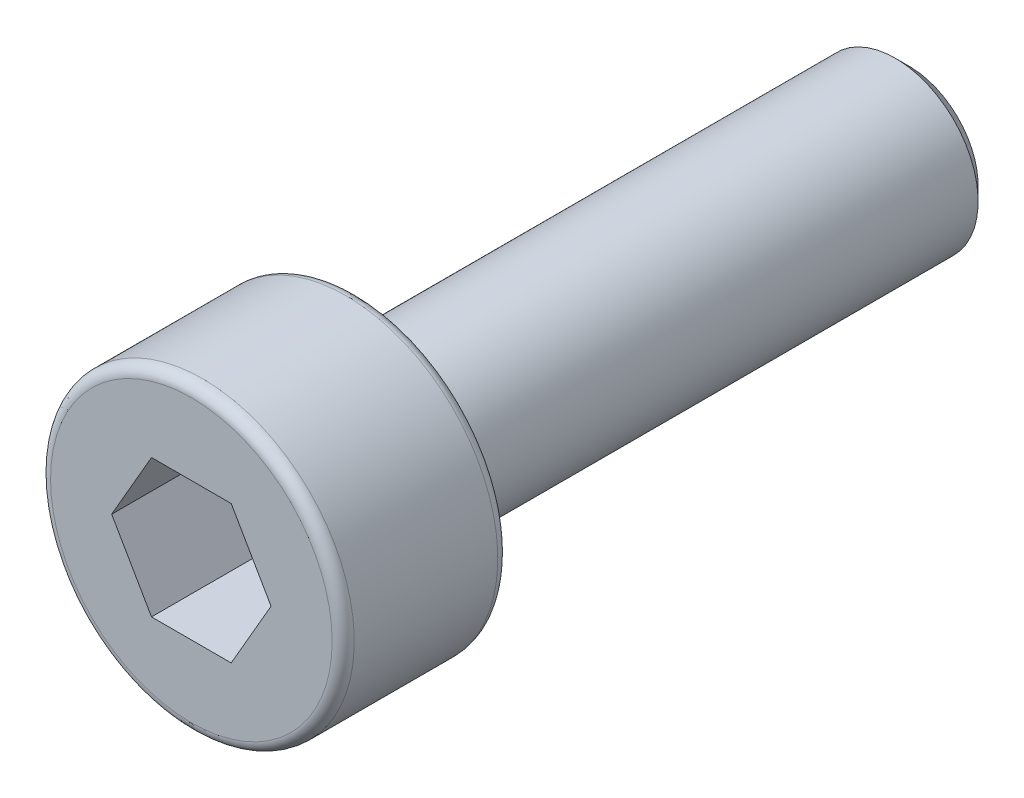
ISO-10303-21;
HEADER;
FILE_DESCRIPTION(('STEP AP214'),'2;1');
FILE_NAME('part.step','',(''),(''),'','','');
FILE_SCHEMA(('AUTOMOTIVE_DESIGN { 1 0 10303 214 1 1 1 1 }'));
ENDSEC;
DATA;
#1=APPLICATION_CONTEXT('core data for automotive mechanical design processes');
#2=APPLICATION_PROTOCOL_DEFINITION('international standard','automotive_design',2000,#1);
#3=PRODUCT_CONTEXT('',#1,'mechanical');
#4=PRODUCT('Part','Part','',(#3));
#5=PRODUCT_RELATED_PRODUCT_CATEGORY('part','',(#4));
#6=PRODUCT_DEFINITION_FORMATION('','',#4);
#7=PRODUCT_DEFINITION_CONTEXT('part definition',#1,'design');
#8=PRODUCT_DEFINITION('design','',#6,#7);
#9=PRODUCT_DEFINITION_SHAPE('','',#8);
#10=(LENGTH_UNIT() NAMED_UNIT(*) SI_UNIT(.MILLI.,.METRE.));
#11=(NAMED_UNIT(*) PLANE_ANGLE_UNIT() SI_UNIT($,.RADIAN.));
#12=(NAMED_UNIT(*) SI_UNIT($,.STERADIAN.) SOLID_ANGLE_UNIT());
#13=UNCERTAINTY_MEASURE_WITH_UNIT(LENGTH_MEASURE(1.E-05),#10,'distance_accuracy_value','');
#14=(GEOMETRIC_REPRESENTATION_CONTEXT(3) GLOBAL_UNCERTAINTY_ASSIGNED_CONTEXT((#13)) GLOBAL_UNIT_ASSIGNED_CONTEXT((#10,
#11,#12)) REPRESENTATION_CONTEXT('',''));
#15=CARTESIAN_POINT('',(0.,0.,0.));
#16=DIRECTION('',(0.,0.,1.));
#17=DIRECTION('',(1.,0.,0.));
#18=AXIS2_PLACEMENT_3D('',#15,#16,#17);
#19=CARTESIAN_POINT('',(0.,0.,10.));
#20=DIRECTION('',(0.,0.,-1.));
#21=DIRECTION('',(-1.,0.,0.));
#22=AXIS2_PLACEMENT_3D('',#19,#20,#21);
#23=PLANE('',#22);
#24=CARTESIAN_POINT('',(0.,0.,10.));
#25=DIRECTION('',(0.,0.,-1.));
#26=DIRECTION('',(-1.,0.,0.));
#27=AXIS2_PLACEMENT_3D('',#24,#25,#26);
#28=CIRCLE('',#27,2.55);
#29=CARTESIAN_POINT('',(-2.55,0.,10.));
#30=VERTEX_POINT('',#29);
#31=EDGE_CURVE('E40',#30,#30,#28,.T.);
#32=ORIENTED_EDGE('',*,*,#31,.T.);
#33=EDGE_LOOP('',(#32));
#34=FACE_BOUND('',#33,.T.);
#35=CARTESIAN_POINT('',(0.,0.,10.));
#36=DIRECTION('',(0.,0.,-1.));
#37=DIRECTION('',(-1.,0.,0.));
#38=AXIS2_PLACEMENT_3D('',#35,#36,#37);
#39=CIRCLE('',#38,1.5);
#40=CARTESIAN_POINT('',(-1.5,0.,10.));
#41=VERTEX_POINT('',#40);
#42=EDGE_CURVE('E134',#41,#41,#39,.T.);
#43=ORIENTED_EDGE('',*,*,#42,.F.);
#44=EDGE_LOOP('',(#43));
#45=FACE_BOUND('',#44,.T.);
#46=ADVANCED_FACE('F32',(#34,#45),#23,.T.);
#47=CARTESIAN_POINT('',(0.,0.,10.));
#48=DIRECTION('',(0.,0.,1.));
#49=DIRECTION('',(1.,0.,0.));
#50=AXIS2_PLACEMENT_3D('',#47,#48,#49);
#51=CYLINDRICAL_SURFACE('',#50,2.75);
#52=CARTESIAN_POINT('',(0.,0.,10.2));
#53=DIRECTION('',(0.,0.,-1.));
#54=DIRECTION('',(-1.,0.,0.));
#55=AXIS2_PLACEMENT_3D('',#52,#53,#54);
#56=CIRCLE('',#55,2.75);
#57=CARTESIAN_POINT('',(-2.75,0.,10.2));
#58=VERTEX_POINT('',#57);
#59=EDGE_CURVE('E151',#58,#58,#56,.F.);
#60=ORIENTED_EDGE('',*,*,#59,.T.);
#61=EDGE_LOOP('',(#60));
#62=FACE_BOUND('',#61,.T.);
#63=CARTESIAN_POINT('',(0.,0.,12.8));
#64=DIRECTION('',(0.,0.,-1.));
#65=DIRECTION('',(-1.,0.,0.));
#66=AXIS2_PLACEMENT_3D('',#63,#64,#65);
#67=CIRCLE('',#66,2.75);
#68=CARTESIAN_POINT('',(-2.75,0.,12.8));
#69=VERTEX_POINT('',#68);
#70=EDGE_CURVE('E148',#69,#69,#67,.T.);
#71=ORIENTED_EDGE('',*,*,#70,.T.);
#72=EDGE_LOOP('',(#71));
#73=FACE_BOUND('',#72,.T.);
#74=ADVANCED_FACE('F164',(#62,#73),#51,.T.);
#75=CARTESIAN_POINT('',(0.,0.,13.));
#76=DIRECTION('',(0.,0.,-1.));
#77=DIRECTION('',(-1.,0.,0.));
#78=AXIS2_PLACEMENT_3D('',#75,#76,#77);
#79=PLANE('',#78);
#80=CARTESIAN_POINT('',(0.,0.,13.));
#81=DIRECTION('',(0.,0.,-1.));
#82=DIRECTION('',(-1.,0.,0.));
#83=AXIS2_PLACEMENT_3D('',#80,#81,#82);
#84=CIRCLE('',#83,2.55);
#85=CARTESIAN_POINT('',(-2.55,0.,13.));
#86=VERTEX_POINT('',#85);
#87=EDGE_CURVE('E11',#86,#86,#84,.F.);
#88=ORIENTED_EDGE('',*,*,#87,.T.);
#89=EDGE_LOOP('',(#88));
#90=FACE_BOUND('',#89,.T.);
#91=DIRECTION('',(0.499999999999997,-0.866025403784441,0.));
#92=VECTOR('',#91,1.);
#93=CARTESIAN_POINT('',(-1.44337567297406,0.,13.));
#94=LINE('',#93,#92);
#95=CARTESIAN_POINT('',(-1.44337567297406,0.,13.));
#96=VERTEX_POINT('',#95);
#97=CARTESIAN_POINT('',(-0.721687836487035,-1.25,13.));
#98=VERTEX_POINT('',#97);
#99=EDGE_CURVE('E121',#96,#98,#94,.T.);
#100=ORIENTED_EDGE('',*,*,#99,.F.);
#101=DIRECTION('',(-0.499999999999998,-0.86602540378444,0.));
#102=VECTOR('',#101,1.);
#103=CARTESIAN_POINT('',(-0.721687836487033,1.25,13.));
#104=LINE('',#103,#102);
#105=CARTESIAN_POINT('',(-0.721687836487033,1.25,13.));
#106=VERTEX_POINT('',#105);
#107=EDGE_CURVE('E47',#106,#96,#104,.T.);
#108=ORIENTED_EDGE('',*,*,#107,.F.);
#109=DIRECTION('',(-1.,0.,0.));
#110=VECTOR('',#109,1.);
#111=CARTESIAN_POINT('',(0.721687836487034,1.25,13.));
#112=LINE('',#111,#110);
#113=CARTESIAN_POINT('',(0.721687836487034,1.25,13.));
#114=VERTEX_POINT('',#113);
#115=EDGE_CURVE('E130',#114,#106,#112,.T.);
#116=ORIENTED_EDGE('',*,*,#115,.F.);
#117=DIRECTION('',(-0.499999999999997,0.86602540378444,0.));
#118=VECTOR('',#117,1.);
#119=CARTESIAN_POINT('',(1.44337567297406,0.,13.));
#120=LINE('',#119,#118);
#121=CARTESIAN_POINT('',(1.44337567297406,0.,13.));
#122=VERTEX_POINT('',#121);
#123=EDGE_CURVE('E128',#122,#114,#120,.T.);
#124=ORIENTED_EDGE('',*,*,#123,.F.);
#125=DIRECTION('',(0.499999999999998,0.86602540378444,0.));
#126=VECTOR('',#125,1.);
#127=CARTESIAN_POINT('',(0.721687836487033,-1.25,13.));
#128=LINE('',#127,#126);
#129=CARTESIAN_POINT('',(0.721687836487033,-1.25,13.));
#130=VERTEX_POINT('',#129);
#131=EDGE_CURVE('E95',#130,#122,#128,.T.);
#132=ORIENTED_EDGE('',*,*,#131,.F.);
#133=DIRECTION('',(1.,0.,0.));
#134=VECTOR('',#133,1.);
#135=CARTESIAN_POINT('',(-0.721687836487035,-1.25,13.));
#136=LINE('',#135,#134);
#137=EDGE_CURVE('E124',#98,#130,#136,.T.);
#138=ORIENTED_EDGE('',*,*,#137,.F.);
#139=EDGE_LOOP('',(#100,#108,#116,#124,#132,#138));
#140=FACE_BOUND('',#139,.T.);
#141=ADVANCED_FACE('F167',(#90,#140),#79,.F.);
#142=CARTESIAN_POINT('',(0.,0.,0.));
#143=DIRECTION('',(0.,0.,1.));
#144=DIRECTION('',(1.,0.,0.));
#145=AXIS2_PLACEMENT_3D('',#142,#143,#144);
#146=CYLINDRICAL_SURFACE('',#145,1.5);
#147=CARTESIAN_POINT('',(0.,0.,0.249999999957933));
#148=DIRECTION('',(0.,0.,-1.));
#149=DIRECTION('',(-1.,0.,0.));
#150=AXIS2_PLACEMENT_3D('',#147,#148,#149);
#151=CIRCLE('',#150,1.5);
#152=CARTESIAN_POINT('',(-1.5,0.,0.249999999957933));
#153=VERTEX_POINT('',#152);
#154=EDGE_CURVE('E145',#153,#153,#151,.F.);
#155=ORIENTED_EDGE('',*,*,#154,.T.);
#156=EDGE_LOOP('',(#155));
#157=FACE_BOUND('',#156,.T.);
#158=ORIENTED_EDGE('',*,*,#42,.T.);
#159=EDGE_LOOP('',(#158));
#160=FACE_BOUND('',#159,.T.);
#161=ADVANCED_FACE('F177',(#157,#160),#146,.T.);
#162=CARTESIAN_POINT('',(0.,0.,0.));
#163=DIRECTION('',(0.,0.,-1.));
#164=DIRECTION('',(-1.,0.,0.));
#165=AXIS2_PLACEMENT_3D('',#162,#163,#164);
#166=PLANE('',#165);
#167=CARTESIAN_POINT('',(0.,0.,0.));
#168=DIRECTION('',(0.,0.,-1.));
#169=DIRECTION('',(-1.,0.,0.));
#170=AXIS2_PLACEMENT_3D('',#167,#168,#169);
#171=CIRCLE('',#170,1.25000000004207);
#172=CARTESIAN_POINT('',(-1.25000000004207,0.,0.));
#173=VERTEX_POINT('',#172);
#174=EDGE_CURVE('E142',#173,#173,#171,.T.);
#175=ORIENTED_EDGE('',*,*,#174,.T.);
#176=EDGE_LOOP('',(#175));
#177=FACE_BOUND('',#176,.T.);
#178=ADVANCED_FACE('F188',(#177),#166,.T.);
#179=CARTESIAN_POINT('',(-0.721687836487033,1.25,11.));
#180=DIRECTION('',(-0.86602540378444,0.499999999999999,0.));
#181=DIRECTION('',(-0.499999999999999,-0.86602540378444,0.));
#182=AXIS2_PLACEMENT_3D('',#179,#180,#181);
#183=PLANE('',#182);
#184=ORIENTED_EDGE('',*,*,#107,.T.);
#185=DIRECTION('',(0.,0.,1.));
#186=VECTOR('',#185,1.);
#187=CARTESIAN_POINT('',(-1.44337567297406,0.,11.));
#188=LINE('',#187,#186);
#189=CARTESIAN_POINT('',(-1.44337567297406,0.,11.));
#190=VERTEX_POINT('',#189);
#191=EDGE_CURVE('E77',#190,#96,#188,.T.);
#192=ORIENTED_EDGE('',*,*,#191,.F.);
#193=DIRECTION('',(-0.499999999999998,-0.86602540378444,0.));
#194=VECTOR('',#193,1.);
#195=CARTESIAN_POINT('',(-0.721687836487033,1.25,11.));
#196=LINE('',#195,#194);
#197=CARTESIAN_POINT('',(-0.721687836487033,1.25,11.));
#198=VERTEX_POINT('',#197);
#199=EDGE_CURVE('E132',#198,#190,#196,.T.);
#200=ORIENTED_EDGE('',*,*,#199,.F.);
#201=DIRECTION('',(0.,0.,1.));
#202=VECTOR('',#201,1.);
#203=CARTESIAN_POINT('',(-0.721687836487033,1.25,11.));
#204=LINE('',#203,#202);
#205=EDGE_CURVE('E55',#198,#106,#204,.T.);
#206=ORIENTED_EDGE('',*,*,#205,.T.);
#207=EDGE_LOOP('',(#184,#192,#200,#206));
#208=FACE_BOUND('',#207,.T.);
#209=ADVANCED_FACE('F185',(#208),#183,.F.);
#210=CARTESIAN_POINT('',(0.721687836487034,1.25,11.));
#211=DIRECTION('',(0.,1.,0.));
#212=DIRECTION('',(0.,0.,1.));
#213=AXIS2_PLACEMENT_3D('',#210,#211,#212);
#214=PLANE('',#213);
#215=ORIENTED_EDGE('',*,*,#115,.T.);
#216=ORIENTED_EDGE('',*,*,#205,.F.);
#217=DIRECTION('',(-1.,0.,0.));
#218=VECTOR('',#217,1.);
#219=CARTESIAN_POINT('',(0.721687836487034,1.25,11.));
#220=LINE('',#219,#218);
#221=CARTESIAN_POINT('',(0.721687836487034,1.25,11.));
#222=VERTEX_POINT('',#221);
#223=EDGE_CURVE('E107',#222,#198,#220,.T.);
#224=ORIENTED_EDGE('',*,*,#223,.F.);
#225=DIRECTION('',(0.,0.,1.));
#226=VECTOR('',#225,1.);
#227=CARTESIAN_POINT('',(0.721687836487034,1.25,11.));
#228=LINE('',#227,#226);
#229=EDGE_CURVE('E99',#222,#114,#228,.T.);
#230=ORIENTED_EDGE('',*,*,#229,.T.);
#231=EDGE_LOOP('',(#215,#216,#224,#230));
#232=FACE_BOUND('',#231,.T.);
#233=ADVANCED_FACE('F187',(#232),#214,.F.);
#234=CARTESIAN_POINT('',(1.44337567297406,0.,11.));
#235=DIRECTION('',(0.86602540378444,0.499999999999997,0.));
#236=DIRECTION('',(-0.499999999999997,0.86602540378444,0.));
#237=AXIS2_PLACEMENT_3D('',#234,#235,#236);
#238=PLANE('',#237);
#239=ORIENTED_EDGE('',*,*,#123,.T.);
#240=ORIENTED_EDGE('',*,*,#229,.F.);
#241=DIRECTION('',(-0.499999999999997,0.86602540378444,0.));
#242=VECTOR('',#241,1.);
#243=CARTESIAN_POINT('',(1.44337567297406,0.,11.));
#244=LINE('',#243,#242);
#245=CARTESIAN_POINT('',(1.44337567297406,0.,11.));
#246=VERTEX_POINT('',#245);
#247=EDGE_CURVE('E103',#246,#222,#244,.T.);
#248=ORIENTED_EDGE('',*,*,#247,.F.);
#249=DIRECTION('',(0.,0.,1.));
#250=VECTOR('',#249,1.);
#251=CARTESIAN_POINT('',(1.44337567297406,0.,11.));
#252=LINE('',#251,#250);
#253=EDGE_CURVE('E88',#246,#122,#252,.T.);
#254=ORIENTED_EDGE('',*,*,#253,.T.);
#255=EDGE_LOOP('',(#239,#240,#248,#254));
#256=FACE_BOUND('',#255,.T.);
#257=ADVANCED_FACE('F104',(#256),#238,.F.);
#258=CARTESIAN_POINT('',(0.721687836487033,-1.25,11.));
#259=DIRECTION('',(0.86602540378444,-0.499999999999998,0.));
#260=DIRECTION('',(0.499999999999998,0.86602540378444,0.));
#261=AXIS2_PLACEMENT_3D('',#258,#259,#260);
#262=PLANE('',#261);
#263=ORIENTED_EDGE('',*,*,#131,.T.);
#264=ORIENTED_EDGE('',*,*,#253,.F.);
#265=DIRECTION('',(0.499999999999998,0.86602540378444,0.));
#266=VECTOR('',#265,1.);
#267=CARTESIAN_POINT('',(0.721687836487033,-1.25,11.));
#268=LINE('',#267,#266);
#269=CARTESIAN_POINT('',(0.721687836487033,-1.25,11.));
#270=VERTEX_POINT('',#269);
#271=EDGE_CURVE('E92',#270,#246,#268,.T.);
#272=ORIENTED_EDGE('',*,*,#271,.F.);
#273=DIRECTION('',(0.,0.,1.));
#274=VECTOR('',#273,1.);
#275=CARTESIAN_POINT('',(0.721687836487033,-1.25,11.));
#276=LINE('',#275,#274);
#277=EDGE_CURVE('E100',#270,#130,#276,.T.);
#278=ORIENTED_EDGE('',*,*,#277,.T.);
#279=EDGE_LOOP('',(#263,#264,#272,#278));
#280=FACE_BOUND('',#279,.T.);
#281=ADVANCED_FACE('F90',(#280),#262,.F.);
#282=CARTESIAN_POINT('',(-0.721687836487035,-1.25,11.));
#283=DIRECTION('',(0.,-1.,0.));
#284=DIRECTION('',(0.,0.,-1.));
#285=AXIS2_PLACEMENT_3D('',#282,#283,#284);
#286=PLANE('',#285);
#287=ORIENTED_EDGE('',*,*,#137,.T.);
#288=ORIENTED_EDGE('',*,*,#277,.F.);
#289=DIRECTION('',(1.,0.,0.));
#290=VECTOR('',#289,1.);
#291=CARTESIAN_POINT('',(-0.721687836487035,-1.25,11.));
#292=LINE('',#291,#290);
#293=CARTESIAN_POINT('',(-0.721687836487035,-1.25,11.));
#294=VERTEX_POINT('',#293);
#295=EDGE_CURVE('E113',#294,#270,#292,.T.);
#296=ORIENTED_EDGE('',*,*,#295,.F.);
#297=DIRECTION('',(0.,0.,1.));
#298=VECTOR('',#297,1.);
#299=CARTESIAN_POINT('',(-0.721687836487035,-1.25,11.));
#300=LINE('',#299,#298);
#301=EDGE_CURVE('E137',#294,#98,#300,.T.);
#302=ORIENTED_EDGE('',*,*,#301,.T.);
#303=EDGE_LOOP('',(#287,#288,#296,#302));
#304=FACE_BOUND('',#303,.T.);
#305=ADVANCED_FACE('F273',(#304),#286,.F.);
#306=CARTESIAN_POINT('',(-1.44337567297406,0.,11.));
#307=DIRECTION('',(-0.866025403784441,-0.499999999999997,0.));
#308=DIRECTION('',(0.499999999999997,-0.866025403784441,0.));
#309=AXIS2_PLACEMENT_3D('',#306,#307,#308);
#310=PLANE('',#309);
#311=ORIENTED_EDGE('',*,*,#99,.T.);
#312=ORIENTED_EDGE('',*,*,#301,.F.);
#313=DIRECTION('',(0.499999999999997,-0.866025403784441,0.));
#314=VECTOR('',#313,1.);
#315=CARTESIAN_POINT('',(-1.44337567297406,0.,11.));
#316=LINE('',#315,#314);
#317=EDGE_CURVE('E115',#190,#294,#316,.T.);
#318=ORIENTED_EDGE('',*,*,#317,.F.);
#319=ORIENTED_EDGE('',*,*,#191,.T.);
#320=EDGE_LOOP('',(#311,#312,#318,#319));
#321=FACE_BOUND('',#320,.T.);
#322=ADVANCED_FACE('F183',(#321),#310,.F.);
#323=CARTESIAN_POINT('',(0.,0.,11.));
#324=DIRECTION('',(0.,0.,1.));
#325=DIRECTION('',(1.,0.,0.));
#326=AXIS2_PLACEMENT_3D('',#323,#324,#325);
#327=PLANE('',#326);
#328=ORIENTED_EDGE('',*,*,#199,.T.);
#329=ORIENTED_EDGE('',*,*,#317,.T.);
#330=ORIENTED_EDGE('',*,*,#295,.T.);
#331=ORIENTED_EDGE('',*,*,#271,.T.);
#332=ORIENTED_EDGE('',*,*,#247,.T.);
#333=ORIENTED_EDGE('',*,*,#223,.T.);
#334=EDGE_LOOP('',(#328,#329,#330,#331,#332,#333));
#335=FACE_BOUND('',#334,.T.);
#336=ADVANCED_FACE('F110',(#335),#327,.T.);
#337=CARTESIAN_POINT('',(0.,0.,0.));
#338=DIRECTION('',(0.,0.,1.));
#339=DIRECTION('',(1.,0.,0.));
#340=AXIS2_PLACEMENT_3D('',#337,#338,#339);
#341=CONICAL_SURFACE('',#340,1.25000000004207,0.785398163397442);
#342=ORIENTED_EDGE('',*,*,#154,.F.);
#343=EDGE_LOOP('',(#342));
#344=FACE_BOUND('',#343,.T.);
#345=ORIENTED_EDGE('',*,*,#174,.F.);
#346=EDGE_LOOP('',(#345));
#347=FACE_BOUND('',#346,.T.);
#348=ADVANCED_FACE('F161',(#344,#347),#341,.T.);
#349=CARTESIAN_POINT('',(0.,0.,10.2));
#350=DIRECTION('',(0.,0.,-1.));
#351=DIRECTION('',(-1.,0.,0.));
#352=AXIS2_PLACEMENT_3D('',#349,#350,#351);
#353=TOROIDAL_SURFACE('',#352,2.55,0.2);
#354=ORIENTED_EDGE('',*,*,#31,.F.);
#355=EDGE_LOOP('',(#354));
#356=FACE_BOUND('',#355,.T.);
#357=ORIENTED_EDGE('',*,*,#59,.F.);
#358=EDGE_LOOP('',(#357));
#359=FACE_BOUND('',#358,.T.);
#360=ADVANCED_FACE('F158',(#356,#359),#353,.T.);
#361=CARTESIAN_POINT('',(0.,0.,12.8));
#362=DIRECTION('',(0.,0.,-1.));
#363=DIRECTION('',(-1.,0.,0.));
#364=AXIS2_PLACEMENT_3D('',#361,#362,#363);
#365=TOROIDAL_SURFACE('',#364,2.55,0.2);
#366=ORIENTED_EDGE('',*,*,#70,.F.);
#367=EDGE_LOOP('',(#366));
#368=FACE_BOUND('',#367,.T.);
#369=ORIENTED_EDGE('',*,*,#87,.F.);
#370=EDGE_LOOP('',(#369));
#371=FACE_BOUND('',#370,.T.);
#372=ADVANCED_FACE('F34',(#368,#371),#365,.T.);
#373=CLOSED_SHELL('',(#46,#74,#141,#161,#178,#209,#233,#257,#281,#305,#322,#336,#348,#360,#372));
#374=MANIFOLD_SOLID_BREP('B2',#373);
#375=ADVANCED_BREP_SHAPE_REPRESENTATION('',(#18,#374),#14);
#376=SHAPE_DEFINITION_REPRESENTATION(#9,#375);
ENDSEC;
END-ISO-10303-21;
